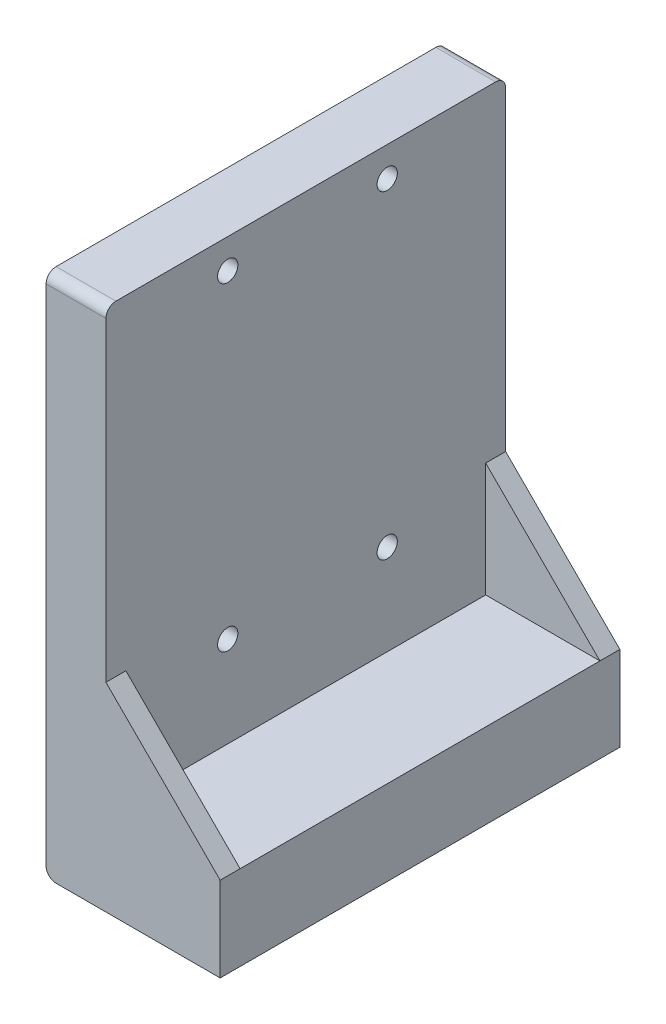
ISO-10303-21;
HEADER;
FILE_DESCRIPTION(('STEP AP214'),'2;1');
FILE_NAME('part.step','',(''),(''),'','','');
FILE_SCHEMA(('AUTOMOTIVE_DESIGN { 1 0 10303 214 1 1 1 1 }'));
ENDSEC;
DATA;
#1=APPLICATION_CONTEXT('core data for automotive mechanical design processes');
#2=APPLICATION_PROTOCOL_DEFINITION('international standard','automotive_design',2000,#1);
#3=PRODUCT_CONTEXT('',#1,'mechanical');
#4=PRODUCT('Part','Part','',(#3));
#5=PRODUCT_RELATED_PRODUCT_CATEGORY('part','',(#4));
#6=PRODUCT_DEFINITION_FORMATION('','',#4);
#7=PRODUCT_DEFINITION_CONTEXT('part definition',#1,'design');
#8=PRODUCT_DEFINITION('design','',#6,#7);
#9=PRODUCT_DEFINITION_SHAPE('','',#8);
#10=(LENGTH_UNIT() NAMED_UNIT(*) SI_UNIT(.MILLI.,.METRE.));
#11=(NAMED_UNIT(*) PLANE_ANGLE_UNIT() SI_UNIT($,.RADIAN.));
#12=(NAMED_UNIT(*) SI_UNIT($,.STERADIAN.) SOLID_ANGLE_UNIT());
#13=UNCERTAINTY_MEASURE_WITH_UNIT(LENGTH_MEASURE(1.E-05),#10,'distance_accuracy_value','');
#14=(GEOMETRIC_REPRESENTATION_CONTEXT(3) GLOBAL_UNCERTAINTY_ASSIGNED_CONTEXT((#13)) GLOBAL_UNIT_ASSIGNED_CONTEXT((#10,
#11,#12)) REPRESENTATION_CONTEXT('',''));
#15=CARTESIAN_POINT('',(0.,0.,0.));
#16=DIRECTION('',(0.,0.,1.));
#17=DIRECTION('',(1.,0.,0.));
#18=AXIS2_PLACEMENT_3D('',#15,#16,#17);
#19=CARTESIAN_POINT('',(6.00000000000001,8.5,40.1));
#20=DIRECTION('',(0.,-1.,0.));
#21=DIRECTION('',(0.,0.,-1.));
#22=AXIS2_PLACEMENT_3D('',#19,#20,#21);
#23=PLANE('',#22);
#24=DIRECTION('',(1.,0.,0.));
#25=VECTOR('',#24,1.);
#26=CARTESIAN_POINT('',(6.00000000000001,8.5,38.1));
#27=LINE('',#26,#25);
#28=CARTESIAN_POINT('',(6.00000000000001,8.5,38.1));
#29=VERTEX_POINT('',#28);
#30=CARTESIAN_POINT('',(17.4625,8.5,38.1));
#31=VERTEX_POINT('',#30);
#32=EDGE_CURVE('E171',#29,#31,#27,.T.);
#33=ORIENTED_EDGE('',*,*,#32,.T.);
#34=DIRECTION('',(0.,0.,1.));
#35=VECTOR('',#34,1.);
#36=CARTESIAN_POINT('',(17.4625,8.5,0.));
#37=LINE('',#36,#35);
#38=CARTESIAN_POINT('',(17.4625,8.5,2.));
#39=VERTEX_POINT('',#38);
#40=EDGE_CURVE('E161',#39,#31,#37,.T.);
#41=ORIENTED_EDGE('',*,*,#40,.F.);
#42=DIRECTION('',(1.,0.,0.));
#43=VECTOR('',#42,1.);
#44=CARTESIAN_POINT('',(6.00000000000001,8.5,2.));
#45=LINE('',#44,#43);
#46=CARTESIAN_POINT('',(6.00000000000001,8.5,2.));
#47=VERTEX_POINT('',#46);
#48=EDGE_CURVE('E166',#47,#39,#45,.T.);
#49=ORIENTED_EDGE('',*,*,#48,.F.);
#50=DIRECTION('',(0.,0.,-1.));
#51=VECTOR('',#50,1.);
#52=CARTESIAN_POINT('',(6.00000000000001,8.5,40.1));
#53=LINE('',#52,#51);
#54=EDGE_CURVE('E217',#29,#47,#53,.T.);
#55=ORIENTED_EDGE('',*,*,#54,.F.);
#56=EDGE_LOOP('',(#33,#41,#49,#55));
#57=FACE_BOUND('',#56,.T.);
#58=ADVANCED_FACE('F34',(#57),#23,.F.);
#59=CARTESIAN_POINT('',(6.,52.578,40.1));
#60=DIRECTION('',(-1.,0.,0.));
#61=DIRECTION('',(0.,-1.,0.));
#62=AXIS2_PLACEMENT_3D('',#59,#60,#61);
#63=PLANE('',#62);
#64=CARTESIAN_POINT('',(6.00000000000001,17.6,27.88));
#65=DIRECTION('',(-1.,0.,0.));
#66=DIRECTION('',(0.,-1.,0.));
#67=AXIS2_PLACEMENT_3D('',#64,#65,#66);
#68=CIRCLE('',#67,1.016);
#69=CARTESIAN_POINT('',(6.00000000000001,16.584,27.88));
#70=VERTEX_POINT('',#69);
#71=EDGE_CURVE('E195',#70,#70,#68,.T.);
#72=ORIENTED_EDGE('',*,*,#71,.T.);
#73=EDGE_LOOP('',(#72));
#74=FACE_BOUND('',#73,.T.);
#75=CARTESIAN_POINT('',(6.00000000000001,17.6,11.88));
#76=DIRECTION('',(-1.,0.,0.));
#77=DIRECTION('',(0.,-1.,0.));
#78=AXIS2_PLACEMENT_3D('',#75,#76,#77);
#79=CIRCLE('',#78,1.016);
#80=CARTESIAN_POINT('',(6.00000000000001,16.584,11.88));
#81=VERTEX_POINT('',#80);
#82=EDGE_CURVE('E189',#81,#81,#79,.T.);
#83=ORIENTED_EDGE('',*,*,#82,.T.);
#84=EDGE_LOOP('',(#83));
#85=FACE_BOUND('',#84,.T.);
#86=DIRECTION('',(0.,-1.,0.));
#87=VECTOR('',#86,1.);
#88=CARTESIAN_POINT('',(6.00000000000001,33.5,2.));
#89=LINE('',#88,#87);
#90=CARTESIAN_POINT('',(6.00000000000001,19.9624999999999,2.));
#91=VERTEX_POINT('',#90);
#92=EDGE_CURVE('E139',#91,#47,#89,.T.);
#93=ORIENTED_EDGE('',*,*,#92,.F.);
#94=DIRECTION('',(0.,0.,1.));
#95=VECTOR('',#94,1.);
#96=CARTESIAN_POINT('',(6.00000000000001,19.9624999999999,0.));
#97=LINE('',#96,#95);
#98=CARTESIAN_POINT('',(6.00000000000001,19.9624999999999,0.));
#99=VERTEX_POINT('',#98);
#100=EDGE_CURVE('E135',#99,#91,#97,.T.);
#101=ORIENTED_EDGE('',*,*,#100,.F.);
#102=DIRECTION('',(0.,1.,0.));
#103=VECTOR('',#102,1.);
#104=CARTESIAN_POINT('',(6.,52.578,0.));
#105=LINE('',#104,#103);
#106=CARTESIAN_POINT('',(6.,51.578,0.));
#107=VERTEX_POINT('',#106);
#108=EDGE_CURVE('E123',#99,#107,#105,.T.);
#109=ORIENTED_EDGE('',*,*,#108,.T.);
#110=CARTESIAN_POINT('',(6.,51.578,1.));
#111=DIRECTION('',(-1.,0.,0.));
#112=DIRECTION('',(0.,-1.,0.));
#113=AXIS2_PLACEMENT_3D('',#110,#111,#112);
#114=CIRCLE('',#113,1.);
#115=CARTESIAN_POINT('',(6.,52.578,1.));
#116=VERTEX_POINT('',#115);
#117=EDGE_CURVE('E235',#107,#116,#114,.F.);
#118=ORIENTED_EDGE('',*,*,#117,.T.);
#119=DIRECTION('',(0.,0.,-1.));
#120=VECTOR('',#119,1.);
#121=CARTESIAN_POINT('',(6.,52.578,40.1));
#122=LINE('',#121,#120);
#123=CARTESIAN_POINT('',(6.,52.578,39.1));
#124=VERTEX_POINT('',#123);
#125=EDGE_CURVE('E214',#124,#116,#122,.T.);
#126=ORIENTED_EDGE('',*,*,#125,.F.);
#127=CARTESIAN_POINT('',(6.,51.578,39.1));
#128=DIRECTION('',(-1.,0.,0.));
#129=DIRECTION('',(0.,-1.,0.));
#130=AXIS2_PLACEMENT_3D('',#127,#128,#129);
#131=CIRCLE('',#130,1.);
#132=CARTESIAN_POINT('',(6.,51.578,40.1));
#133=VERTEX_POINT('',#132);
#134=EDGE_CURVE('E237',#124,#133,#131,.F.);
#135=ORIENTED_EDGE('',*,*,#134,.T.);
#136=DIRECTION('',(0.,1.,0.));
#137=VECTOR('',#136,1.);
#138=CARTESIAN_POINT('',(6.,52.578,40.1));
#139=LINE('',#138,#137);
#140=CARTESIAN_POINT('',(6.00000000000001,19.9624999999999,40.1));
#141=VERTEX_POINT('',#140);
#142=EDGE_CURVE('E201',#141,#133,#139,.T.);
#143=ORIENTED_EDGE('',*,*,#142,.F.);
#144=CARTESIAN_POINT('',(6.00000000000001,19.9624999999999,38.1));
#145=VERTEX_POINT('',#144);
#146=EDGE_CURVE('E142',#145,#141,#97,.T.);
#147=ORIENTED_EDGE('',*,*,#146,.F.);
#148=DIRECTION('',(0.,-1.,0.));
#149=VECTOR('',#148,1.);
#150=CARTESIAN_POINT('',(6.00000000000001,33.5,38.1));
#151=LINE('',#150,#149);
#152=EDGE_CURVE('E169',#145,#29,#151,.T.);
#153=ORIENTED_EDGE('',*,*,#152,.T.);
#154=ORIENTED_EDGE('',*,*,#54,.T.);
#155=EDGE_LOOP('',(#93,#101,#109,#118,#126,#135,#143,#147,#153,#154));
#156=FACE_BOUND('',#155,.T.);
#157=CARTESIAN_POINT('',(6.,49.6,11.88));
#158=DIRECTION('',(-1.,0.,0.));
#159=DIRECTION('',(0.,-1.,0.));
#160=AXIS2_PLACEMENT_3D('',#157,#158,#159);
#161=CIRCLE('',#160,1.016);
#162=CARTESIAN_POINT('',(6.,48.584,11.88));
#163=VERTEX_POINT('',#162);
#164=EDGE_CURVE('E177',#163,#163,#161,.T.);
#165=ORIENTED_EDGE('',*,*,#164,.T.);
#166=EDGE_LOOP('',(#165));
#167=FACE_BOUND('',#166,.T.);
#168=CARTESIAN_POINT('',(6.,49.6,27.88));
#169=DIRECTION('',(-1.,0.,0.));
#170=DIRECTION('',(0.,-1.,0.));
#171=AXIS2_PLACEMENT_3D('',#168,#169,#170);
#172=CIRCLE('',#171,1.016);
#173=CARTESIAN_POINT('',(6.,48.584,27.88));
#174=VERTEX_POINT('',#173);
#175=EDGE_CURVE('E183',#174,#174,#172,.T.);
#176=ORIENTED_EDGE('',*,*,#175,.T.);
#177=EDGE_LOOP('',(#176));
#178=FACE_BOUND('',#177,.T.);
#179=ADVANCED_FACE('F136',(#74,#85,#156,#167,#178),#63,.F.);
#180=CARTESIAN_POINT('',(76.,0.,40.1));
#181=DIRECTION('',(0.,1.,0.));
#182=DIRECTION('',(-1.,0.,0.));
#183=AXIS2_PLACEMENT_3D('',#180,#181,#182);
#184=PLANE('',#183);
#185=DIRECTION('',(1.,0.,0.));
#186=VECTOR('',#185,1.);
#187=CARTESIAN_POINT('',(76.,0.,0.));
#188=LINE('',#187,#186);
#189=CARTESIAN_POINT('',(1.,0.,0.));
#190=VERTEX_POINT('',#189);
#191=CARTESIAN_POINT('',(17.4625,0.,0.));
#192=VERTEX_POINT('',#191);
#193=EDGE_CURVE('E132',#190,#192,#188,.T.);
#194=ORIENTED_EDGE('',*,*,#193,.T.);
#195=DIRECTION('',(0.,0.,1.));
#196=VECTOR('',#195,1.);
#197=CARTESIAN_POINT('',(17.4625,0.,0.));
#198=LINE('',#197,#196);
#199=CARTESIAN_POINT('',(17.4625,0.,40.1));
#200=VERTEX_POINT('',#199);
#201=EDGE_CURVE('E157',#192,#200,#198,.T.);
#202=ORIENTED_EDGE('',*,*,#201,.T.);
#203=DIRECTION('',(1.,0.,0.));
#204=VECTOR('',#203,1.);
#205=CARTESIAN_POINT('',(76.,0.,40.1));
#206=LINE('',#205,#204);
#207=CARTESIAN_POINT('',(1.,0.,40.1));
#208=VERTEX_POINT('',#207);
#209=EDGE_CURVE('E198',#208,#200,#206,.T.);
#210=ORIENTED_EDGE('',*,*,#209,.F.);
#211=DIRECTION('',(0.,0.,-1.));
#212=VECTOR('',#211,1.);
#213=CARTESIAN_POINT('',(1.,0.,40.1));
#214=LINE('',#213,#212);
#215=EDGE_CURVE('E42',#208,#190,#214,.T.);
#216=ORIENTED_EDGE('',*,*,#215,.T.);
#217=EDGE_LOOP('',(#194,#202,#210,#216));
#218=FACE_BOUND('',#217,.T.);
#219=ADVANCED_FACE('F243',(#218),#184,.F.);
#220=CARTESIAN_POINT('',(0.,52.578,40.1));
#221=DIRECTION('',(0.,-1.,0.));
#222=DIRECTION('',(0.,0.,-1.));
#223=AXIS2_PLACEMENT_3D('',#220,#221,#222);
#224=PLANE('',#223);
#225=DIRECTION('',(0.,0.,-1.));
#226=VECTOR('',#225,1.);
#227=CARTESIAN_POINT('',(0.,52.578,40.1));
#228=LINE('',#227,#226);
#229=CARTESIAN_POINT('',(0.,52.578,39.1));
#230=VERTEX_POINT('',#229);
#231=CARTESIAN_POINT('',(0.,52.578,1.));
#232=VERTEX_POINT('',#231);
#233=EDGE_CURVE('E207',#230,#232,#228,.T.);
#234=ORIENTED_EDGE('',*,*,#233,.F.);
#235=DIRECTION('',(-1.,0.,0.));
#236=VECTOR('',#235,1.);
#237=CARTESIAN_POINT('',(0.,52.578,39.1));
#238=LINE('',#237,#236);
#239=EDGE_CURVE('E233',#230,#124,#238,.F.);
#240=ORIENTED_EDGE('',*,*,#239,.T.);
#241=ORIENTED_EDGE('',*,*,#125,.T.);
#242=DIRECTION('',(-1.,0.,0.));
#243=VECTOR('',#242,1.);
#244=CARTESIAN_POINT('',(0.,52.578,1.));
#245=LINE('',#244,#243);
#246=EDGE_CURVE('E230',#116,#232,#245,.T.);
#247=ORIENTED_EDGE('',*,*,#246,.T.);
#248=EDGE_LOOP('',(#234,#240,#241,#247));
#249=FACE_BOUND('',#248,.T.);
#250=ADVANCED_FACE('F263',(#249),#224,.F.);
#251=CARTESIAN_POINT('',(0.,0.,40.1));
#252=DIRECTION('',(1.,0.,0.));
#253=DIRECTION('',(0.,0.,-1.));
#254=AXIS2_PLACEMENT_3D('',#251,#252,#253);
#255=PLANE('',#254);
#256=CARTESIAN_POINT('',(0.,49.6,11.88));
#257=DIRECTION('',(-1.,0.,0.));
#258=DIRECTION('',(0.,0.,-1.));
#259=AXIS2_PLACEMENT_3D('',#256,#257,#258);
#260=CIRCLE('',#259,1.016);
#261=CARTESIAN_POINT('',(0.,49.6,10.864));
#262=VERTEX_POINT('',#261);
#263=EDGE_CURVE('E174',#262,#262,#260,.T.);
#264=ORIENTED_EDGE('',*,*,#263,.F.);
#265=EDGE_LOOP('',(#264));
#266=FACE_BOUND('',#265,.T.);
#267=CARTESIAN_POINT('',(0.,49.6,27.88));
#268=DIRECTION('',(-1.,0.,0.));
#269=DIRECTION('',(0.,0.,1.));
#270=AXIS2_PLACEMENT_3D('',#267,#268,#269);
#271=CIRCLE('',#270,1.016);
#272=CARTESIAN_POINT('',(0.,49.6,28.896));
#273=VERTEX_POINT('',#272);
#274=EDGE_CURVE('E180',#273,#273,#271,.T.);
#275=ORIENTED_EDGE('',*,*,#274,.F.);
#276=EDGE_LOOP('',(#275));
#277=FACE_BOUND('',#276,.T.);
#278=CARTESIAN_POINT('',(0.,17.6,11.88));
#279=DIRECTION('',(-1.,0.,0.));
#280=DIRECTION('',(0.,0.,-1.));
#281=AXIS2_PLACEMENT_3D('',#278,#279,#280);
#282=CIRCLE('',#281,1.016);
#283=CARTESIAN_POINT('',(0.,17.6,10.864));
#284=VERTEX_POINT('',#283);
#285=EDGE_CURVE('E186',#284,#284,#282,.T.);
#286=ORIENTED_EDGE('',*,*,#285,.F.);
#287=EDGE_LOOP('',(#286));
#288=FACE_BOUND('',#287,.T.);
#289=CARTESIAN_POINT('',(0.,17.6,27.88));
#290=DIRECTION('',(-1.,0.,0.));
#291=DIRECTION('',(0.,0.,1.));
#292=AXIS2_PLACEMENT_3D('',#289,#290,#291);
#293=CIRCLE('',#292,1.016);
#294=CARTESIAN_POINT('',(0.,17.6,28.896));
#295=VERTEX_POINT('',#294);
#296=EDGE_CURVE('E192',#295,#295,#293,.T.);
#297=ORIENTED_EDGE('',*,*,#296,.F.);
#298=EDGE_LOOP('',(#297));
#299=FACE_BOUND('',#298,.T.);
#300=DIRECTION('',(0.,-1.,0.));
#301=VECTOR('',#300,1.);
#302=CARTESIAN_POINT('',(0.,0.,40.1));
#303=LINE('',#302,#301);
#304=CARTESIAN_POINT('',(0.,51.578,40.1));
#305=VERTEX_POINT('',#304);
#306=CARTESIAN_POINT('',(0.,1.,40.1));
#307=VERTEX_POINT('',#306);
#308=EDGE_CURVE('E204',#305,#307,#303,.T.);
#309=ORIENTED_EDGE('',*,*,#308,.F.);
#310=CARTESIAN_POINT('',(0.,51.578,39.1));
#311=DIRECTION('',(1.,0.,0.));
#312=DIRECTION('',(0.,0.,-1.));
#313=AXIS2_PLACEMENT_3D('',#310,#311,#312);
#314=CIRCLE('',#313,1.);
#315=EDGE_CURVE('E228',#305,#230,#314,.F.);
#316=ORIENTED_EDGE('',*,*,#315,.T.);
#317=ORIENTED_EDGE('',*,*,#233,.T.);
#318=CARTESIAN_POINT('',(0.,51.578,1.));
#319=DIRECTION('',(1.,0.,0.));
#320=DIRECTION('',(0.,0.,-1.));
#321=AXIS2_PLACEMENT_3D('',#318,#319,#320);
#322=CIRCLE('',#321,1.);
#323=CARTESIAN_POINT('',(0.,51.578,0.));
#324=VERTEX_POINT('',#323);
#325=EDGE_CURVE('E226',#232,#324,#322,.F.);
#326=ORIENTED_EDGE('',*,*,#325,.T.);
#327=DIRECTION('',(0.,-1.,0.));
#328=VECTOR('',#327,1.);
#329=CARTESIAN_POINT('',(0.,0.,0.));
#330=LINE('',#329,#328);
#331=CARTESIAN_POINT('',(0.,1.,0.));
#332=VERTEX_POINT('',#331);
#333=EDGE_CURVE('E131',#324,#332,#330,.T.);
#334=ORIENTED_EDGE('',*,*,#333,.T.);
#335=DIRECTION('',(0.,0.,-1.));
#336=VECTOR('',#335,1.);
#337=CARTESIAN_POINT('',(0.,1.,40.1));
#338=LINE('',#337,#336);
#339=EDGE_CURVE('E224',#332,#307,#338,.F.);
#340=ORIENTED_EDGE('',*,*,#339,.T.);
#341=EDGE_LOOP('',(#309,#316,#317,#326,#334,#340));
#342=FACE_BOUND('',#341,.T.);
#343=ADVANCED_FACE('F255',(#266,#277,#288,#299,#342),#255,.F.);
#344=CARTESIAN_POINT('',(0.,0.,40.1));
#345=DIRECTION('',(0.,0.,-1.));
#346=DIRECTION('',(-1.,0.,0.));
#347=AXIS2_PLACEMENT_3D('',#344,#345,#346);
#348=PLANE('',#347);
#349=ORIENTED_EDGE('',*,*,#209,.T.);
#350=DIRECTION('',(0.,-1.,0.));
#351=VECTOR('',#350,1.);
#352=CARTESIAN_POINT('',(17.4625,0.,40.1));
#353=LINE('',#352,#351);
#354=CARTESIAN_POINT('',(17.4625,8.5,40.1));
#355=VERTEX_POINT('',#354);
#356=EDGE_CURVE('E149',#355,#200,#353,.T.);
#357=ORIENTED_EDGE('',*,*,#356,.F.);
#358=DIRECTION('',(0.707106781186551,-0.707106781186544,0.));
#359=VECTOR('',#358,1.);
#360=CARTESIAN_POINT('',(17.4625,8.5,40.1));
#361=LINE('',#360,#359);
#362=EDGE_CURVE('E152',#141,#355,#361,.T.);
#363=ORIENTED_EDGE('',*,*,#362,.F.);
#364=ORIENTED_EDGE('',*,*,#142,.T.);
#365=DIRECTION('',(-1.,0.,0.));
#366=VECTOR('',#365,1.);
#367=CARTESIAN_POINT('',(0.,51.578,40.1));
#368=LINE('',#367,#366);
#369=EDGE_CURVE('E221',#133,#305,#368,.T.);
#370=ORIENTED_EDGE('',*,*,#369,.T.);
#371=ORIENTED_EDGE('',*,*,#308,.T.);
#372=CARTESIAN_POINT('',(1.,1.,40.1));
#373=DIRECTION('',(0.,0.,-1.));
#374=DIRECTION('',(-1.,0.,0.));
#375=AXIS2_PLACEMENT_3D('',#372,#373,#374);
#376=CIRCLE('',#375,1.);
#377=EDGE_CURVE('E219',#307,#208,#376,.F.);
#378=ORIENTED_EDGE('',*,*,#377,.T.);
#379=EDGE_LOOP('',(#349,#357,#363,#364,#370,#371,#378));
#380=FACE_BOUND('',#379,.T.);
#381=ADVANCED_FACE('F251',(#380),#348,.F.);
#382=CARTESIAN_POINT('',(0.,0.,0.));
#383=DIRECTION('',(0.,0.,-1.));
#384=DIRECTION('',(-1.,0.,0.));
#385=AXIS2_PLACEMENT_3D('',#382,#383,#384);
#386=PLANE('',#385);
#387=DIRECTION('',(0.,-1.,0.));
#388=VECTOR('',#387,1.);
#389=CARTESIAN_POINT('',(17.4625,0.,0.));
#390=LINE('',#389,#388);
#391=CARTESIAN_POINT('',(17.4625,8.5,0.));
#392=VERTEX_POINT('',#391);
#393=EDGE_CURVE('E148',#392,#192,#390,.T.);
#394=ORIENTED_EDGE('',*,*,#393,.T.);
#395=ORIENTED_EDGE('',*,*,#193,.F.);
#396=CARTESIAN_POINT('',(1.,1.,0.));
#397=DIRECTION('',(0.,0.,-1.));
#398=DIRECTION('',(-1.,0.,0.));
#399=AXIS2_PLACEMENT_3D('',#396,#397,#398);
#400=CIRCLE('',#399,1.);
#401=EDGE_CURVE('E49',#190,#332,#400,.T.);
#402=ORIENTED_EDGE('',*,*,#401,.T.);
#403=ORIENTED_EDGE('',*,*,#333,.F.);
#404=DIRECTION('',(-1.,0.,0.));
#405=VECTOR('',#404,1.);
#406=CARTESIAN_POINT('',(6.,51.578,0.));
#407=LINE('',#406,#405);
#408=EDGE_CURVE('E57',#324,#107,#407,.F.);
#409=ORIENTED_EDGE('',*,*,#408,.T.);
#410=ORIENTED_EDGE('',*,*,#108,.F.);
#411=DIRECTION('',(0.707106781186551,-0.707106781186544,0.));
#412=VECTOR('',#411,1.);
#413=CARTESIAN_POINT('',(17.4625,8.5,0.));
#414=LINE('',#413,#412);
#415=EDGE_CURVE('E128',#99,#392,#414,.T.);
#416=ORIENTED_EDGE('',*,*,#415,.T.);
#417=EDGE_LOOP('',(#394,#395,#402,#403,#409,#410,#416));
#418=FACE_BOUND('',#417,.T.);
#419=ADVANCED_FACE('F126',(#418),#386,.T.);
#420=CARTESIAN_POINT('',(50.8,17.6,27.88));
#421=DIRECTION('',(-1.,0.,0.));
#422=DIRECTION('',(0.,0.,1.));
#423=AXIS2_PLACEMENT_3D('',#420,#421,#422);
#424=CYLINDRICAL_SURFACE('',#423,1.016);
#425=ORIENTED_EDGE('',*,*,#296,.T.);
#426=EDGE_LOOP('',(#425));
#427=FACE_BOUND('',#426,.T.);
#428=ORIENTED_EDGE('',*,*,#71,.F.);
#429=EDGE_LOOP('',(#428));
#430=FACE_BOUND('',#429,.T.);
#431=ADVANCED_FACE('F347',(#427,#430),#424,.F.);
#432=CARTESIAN_POINT('',(50.8,17.6,11.88));
#433=DIRECTION('',(-1.,0.,0.));
#434=DIRECTION('',(0.,0.,1.));
#435=AXIS2_PLACEMENT_3D('',#432,#433,#434);
#436=CYLINDRICAL_SURFACE('',#435,1.016);
#437=ORIENTED_EDGE('',*,*,#285,.T.);
#438=EDGE_LOOP('',(#437));
#439=FACE_BOUND('',#438,.T.);
#440=ORIENTED_EDGE('',*,*,#82,.F.);
#441=EDGE_LOOP('',(#440));
#442=FACE_BOUND('',#441,.T.);
#443=ADVANCED_FACE('F419',(#439,#442),#436,.F.);
#444=CARTESIAN_POINT('',(50.8,49.6,27.88));
#445=DIRECTION('',(-1.,0.,0.));
#446=DIRECTION('',(0.,0.,1.));
#447=AXIS2_PLACEMENT_3D('',#444,#445,#446);
#448=CYLINDRICAL_SURFACE('',#447,1.016);
#449=ORIENTED_EDGE('',*,*,#274,.T.);
#450=EDGE_LOOP('',(#449));
#451=FACE_BOUND('',#450,.T.);
#452=ORIENTED_EDGE('',*,*,#175,.F.);
#453=EDGE_LOOP('',(#452));
#454=FACE_BOUND('',#453,.T.);
#455=ADVANCED_FACE('F409',(#451,#454),#448,.F.);
#456=CARTESIAN_POINT('',(50.8,49.6,11.88));
#457=DIRECTION('',(-1.,0.,0.));
#458=DIRECTION('',(0.,0.,1.));
#459=AXIS2_PLACEMENT_3D('',#456,#457,#458);
#460=CYLINDRICAL_SURFACE('',#459,1.016);
#461=ORIENTED_EDGE('',*,*,#263,.T.);
#462=EDGE_LOOP('',(#461));
#463=FACE_BOUND('',#462,.T.);
#464=ORIENTED_EDGE('',*,*,#164,.F.);
#465=EDGE_LOOP('',(#464));
#466=FACE_BOUND('',#465,.T.);
#467=ADVANCED_FACE('F288',(#463,#466),#460,.F.);
#468=CARTESIAN_POINT('',(0.,0.,38.1));
#469=DIRECTION('',(0.,0.,1.));
#470=DIRECTION('',(1.,0.,0.));
#471=AXIS2_PLACEMENT_3D('',#468,#469,#470);
#472=PLANE('',#471);
#473=ORIENTED_EDGE('',*,*,#152,.F.);
#474=DIRECTION('',(0.707106781186551,-0.707106781186544,0.));
#475=VECTOR('',#474,1.);
#476=CARTESIAN_POINT('',(12.9812499999999,12.9812500000001,38.1));
#477=LINE('',#476,#475);
#478=EDGE_CURVE('E160',#145,#31,#477,.T.);
#479=ORIENTED_EDGE('',*,*,#478,.T.);
#480=ORIENTED_EDGE('',*,*,#32,.F.);
#481=EDGE_LOOP('',(#473,#479,#480));
#482=FACE_BOUND('',#481,.T.);
#483=ADVANCED_FACE('F275',(#482),#472,.F.);
#484=CARTESIAN_POINT('',(0.,0.,2.));
#485=DIRECTION('',(0.,0.,-1.));
#486=DIRECTION('',(1.,0.,0.));
#487=AXIS2_PLACEMENT_3D('',#484,#485,#486);
#488=PLANE('',#487);
#489=ORIENTED_EDGE('',*,*,#48,.T.);
#490=DIRECTION('',(-0.707106781186551,0.707106781186544,0.));
#491=VECTOR('',#490,1.);
#492=CARTESIAN_POINT('',(12.9812499999999,12.9812500000001,2.));
#493=LINE('',#492,#491);
#494=EDGE_CURVE('E11',#39,#91,#493,.T.);
#495=ORIENTED_EDGE('',*,*,#494,.T.);
#496=ORIENTED_EDGE('',*,*,#92,.T.);
#497=EDGE_LOOP('',(#489,#495,#496));
#498=FACE_BOUND('',#497,.T.);
#499=ADVANCED_FACE('F280',(#498),#488,.F.);
#500=CARTESIAN_POINT('',(0.,51.578,39.1));
#501=DIRECTION('',(-1.,0.,0.));
#502=DIRECTION('',(0.,0.,1.));
#503=AXIS2_PLACEMENT_3D('',#500,#501,#502);
#504=CYLINDRICAL_SURFACE('',#503,1.);
#505=ORIENTED_EDGE('',*,*,#134,.F.);
#506=ORIENTED_EDGE('',*,*,#239,.F.);
#507=ORIENTED_EDGE('',*,*,#315,.F.);
#508=ORIENTED_EDGE('',*,*,#369,.F.);
#509=EDGE_LOOP('',(#505,#506,#507,#508));
#510=FACE_BOUND('',#509,.T.);
#511=ADVANCED_FACE('F266',(#510),#504,.T.);
#512=CARTESIAN_POINT('',(0.,51.578,1.));
#513=DIRECTION('',(1.,0.,0.));
#514=DIRECTION('',(0.,0.,-1.));
#515=AXIS2_PLACEMENT_3D('',#512,#513,#514);
#516=CYLINDRICAL_SURFACE('',#515,1.);
#517=ORIENTED_EDGE('',*,*,#117,.F.);
#518=ORIENTED_EDGE('',*,*,#408,.F.);
#519=ORIENTED_EDGE('',*,*,#325,.F.);
#520=ORIENTED_EDGE('',*,*,#246,.F.);
#521=EDGE_LOOP('',(#517,#518,#519,#520));
#522=FACE_BOUND('',#521,.T.);
#523=ADVANCED_FACE('F257',(#522),#516,.T.);
#524=CARTESIAN_POINT('',(1.,1.,40.1));
#525=DIRECTION('',(0.,0.,-1.));
#526=DIRECTION('',(-1.,0.,0.));
#527=AXIS2_PLACEMENT_3D('',#524,#525,#526);
#528=CYLINDRICAL_SURFACE('',#527,1.);
#529=ORIENTED_EDGE('',*,*,#377,.F.);
#530=ORIENTED_EDGE('',*,*,#339,.F.);
#531=ORIENTED_EDGE('',*,*,#401,.F.);
#532=ORIENTED_EDGE('',*,*,#215,.F.);
#533=EDGE_LOOP('',(#529,#530,#531,#532));
#534=FACE_BOUND('',#533,.T.);
#535=ADVANCED_FACE('F36',(#534),#528,.T.);
#536=CARTESIAN_POINT('',(17.4625,8.5,0.));
#537=DIRECTION('',(-0.707106781186544,-0.707106781186551,0.));
#538=DIRECTION('',(0.707106781186551,-0.707106781186544,0.));
#539=AXIS2_PLACEMENT_3D('',#536,#537,#538);
#540=PLANE('',#539);
#541=ORIENTED_EDGE('',*,*,#146,.T.);
#542=ORIENTED_EDGE('',*,*,#362,.T.);
#543=EDGE_CURVE('E141',#31,#355,#37,.T.);
#544=ORIENTED_EDGE('',*,*,#543,.F.);
#545=ORIENTED_EDGE('',*,*,#478,.F.);
#546=EDGE_LOOP('',(#541,#542,#544,#545));
#547=FACE_BOUND('',#546,.T.);
#548=ADVANCED_FACE('F271',(#547),#540,.F.);
#549=EDGE_CURVE('E146',#392,#39,#37,.T.);
#550=ORIENTED_EDGE('',*,*,#549,.F.);
#551=ORIENTED_EDGE('',*,*,#415,.F.);
#552=ORIENTED_EDGE('',*,*,#100,.T.);
#553=ORIENTED_EDGE('',*,*,#494,.F.);
#554=EDGE_LOOP('',(#550,#551,#552,#553));
#555=FACE_BOUND('',#554,.T.);
#556=ADVANCED_FACE('F144',(#555),#540,.F.);
#557=CARTESIAN_POINT('',(17.4625,0.,0.));
#558=DIRECTION('',(-1.,0.,0.));
#559=DIRECTION('',(0.,0.,1.));
#560=AXIS2_PLACEMENT_3D('',#557,#558,#559);
#561=PLANE('',#560);
#562=ORIENTED_EDGE('',*,*,#356,.T.);
#563=ORIENTED_EDGE('',*,*,#201,.F.);
#564=ORIENTED_EDGE('',*,*,#393,.F.);
#565=ORIENTED_EDGE('',*,*,#549,.T.);
#566=ORIENTED_EDGE('',*,*,#40,.T.);
#567=ORIENTED_EDGE('',*,*,#543,.T.);
#568=EDGE_LOOP('',(#562,#563,#564,#565,#566,#567));
#569=FACE_BOUND('',#568,.T.);
#570=ADVANCED_FACE('F246',(#569),#561,.F.);
#571=CLOSED_SHELL('',(#58,#179,#219,#250,#343,#381,#419,#431,#443,#455,#467,#483,#499,#511,#523,
#535,#548,#556,#570));
#572=MANIFOLD_SOLID_BREP('B2',#571);
#573=ADVANCED_BREP_SHAPE_REPRESENTATION('',(#18,#572),#14);
#574=SHAPE_DEFINITION_REPRESENTATION(#9,#573);
ENDSEC;
END-ISO-10303-21;
